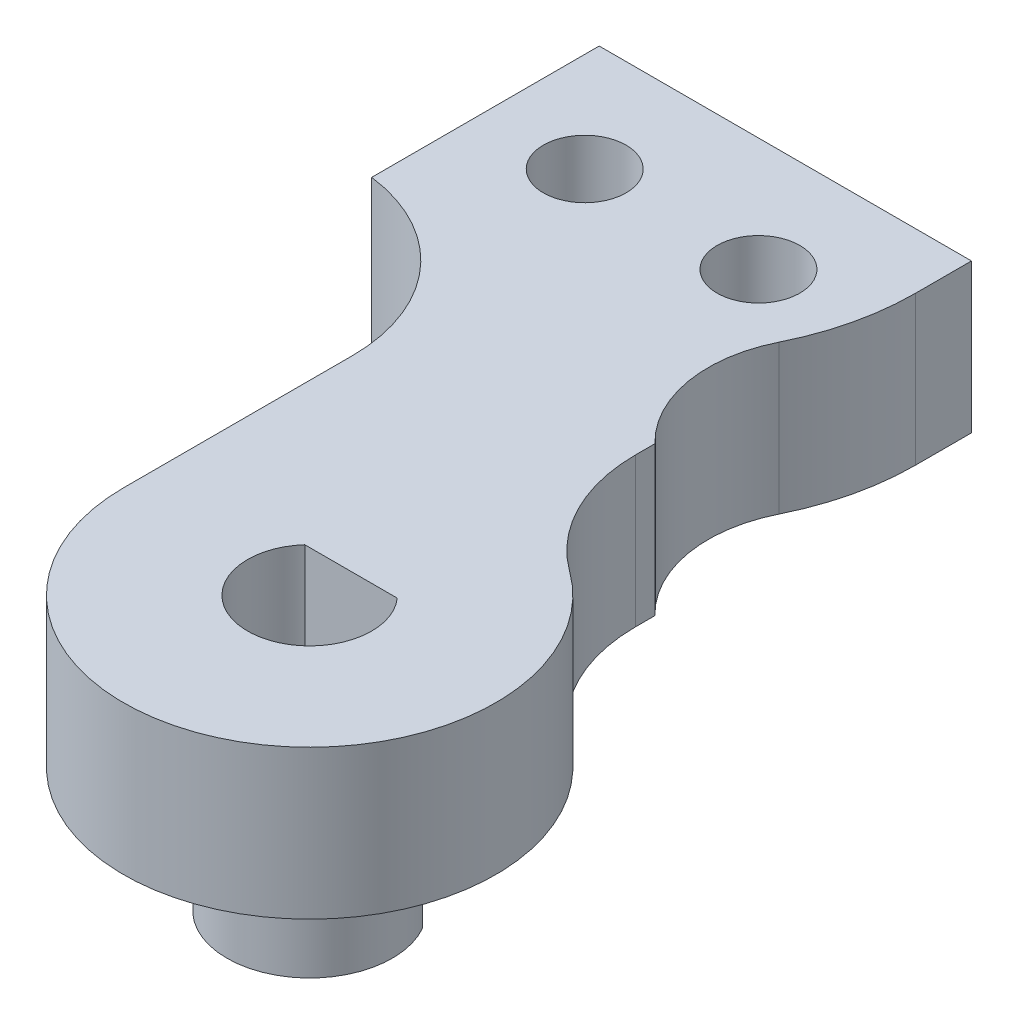
ISO-10303-21;
HEADER;
FILE_DESCRIPTION(('STEP AP214'),'2;1');
FILE_NAME('part.step','',(''),(''),'','','');
FILE_SCHEMA(('AUTOMOTIVE_DESIGN { 1 0 10303 214 1 1 1 1 }'));
ENDSEC;
DATA;
#1=APPLICATION_CONTEXT('core data for automotive mechanical design processes');
#2=APPLICATION_PROTOCOL_DEFINITION('international standard','automotive_design',2000,#1);
#3=PRODUCT_CONTEXT('',#1,'mechanical');
#4=PRODUCT('Part','Part','',(#3));
#5=PRODUCT_RELATED_PRODUCT_CATEGORY('part','',(#4));
#6=PRODUCT_DEFINITION_FORMATION('','',#4);
#7=PRODUCT_DEFINITION_CONTEXT('part definition',#1,'design');
#8=PRODUCT_DEFINITION('design','',#6,#7);
#9=PRODUCT_DEFINITION_SHAPE('','',#8);
#10=(LENGTH_UNIT() NAMED_UNIT(*) SI_UNIT(.MILLI.,.METRE.));
#11=(NAMED_UNIT(*) PLANE_ANGLE_UNIT() SI_UNIT($,.RADIAN.));
#12=(NAMED_UNIT(*) SI_UNIT($,.STERADIAN.) SOLID_ANGLE_UNIT());
#13=UNCERTAINTY_MEASURE_WITH_UNIT(LENGTH_MEASURE(1.E-05),#10,'distance_accuracy_value','');
#14=(GEOMETRIC_REPRESENTATION_CONTEXT(3) GLOBAL_UNCERTAINTY_ASSIGNED_CONTEXT((#13)) GLOBAL_UNIT_ASSIGNED_CONTEXT((#10,
#11,#12)) REPRESENTATION_CONTEXT('',''));
#15=CARTESIAN_POINT('',(0.,0.,0.));
#16=DIRECTION('',(0.,0.,1.));
#17=DIRECTION('',(1.,0.,0.));
#18=AXIS2_PLACEMENT_3D('',#15,#16,#17);
#19=CARTESIAN_POINT('',(4.5,-11.2,3.));
#20=DIRECTION('',(-1.,0.,0.));
#21=DIRECTION('',(0.,0.,1.));
#22=AXIS2_PLACEMENT_3D('',#19,#20,#21);
#23=PLANE('',#22);
#24=DIRECTION('',(0.,1.,0.));
#25=VECTOR('',#24,1.);
#26=CARTESIAN_POINT('',(4.5,-11.2,8.12613645756624));
#27=LINE('',#26,#25);
#28=CARTESIAN_POINT('',(4.5,-8.2,8.12613645756624));
#29=VERTEX_POINT('',#28);
#30=CARTESIAN_POINT('',(4.5,-11.8,8.12613645756624));
#31=VERTEX_POINT('',#30);
#32=EDGE_CURVE('E272',#29,#31,#27,.F.);
#33=ORIENTED_EDGE('',*,*,#32,.T.);
#34=DIRECTION('',(0.,0.,1.));
#35=VECTOR('',#34,1.);
#36=CARTESIAN_POINT('',(4.5,-11.8,7.65292663552222));
#37=LINE('',#36,#35);
#38=CARTESIAN_POINT('',(4.5,-11.8,7.65292663552222));
#39=VERTEX_POINT('',#38);
#40=EDGE_CURVE('E209',#39,#31,#37,.T.);
#41=ORIENTED_EDGE('',*,*,#40,.F.);
#42=DIRECTION('',(0.,1.,0.));
#43=VECTOR('',#42,1.);
#44=CARTESIAN_POINT('',(4.5,-11.201,7.65292663552222));
#45=LINE('',#44,#43);
#46=CARTESIAN_POINT('',(4.5,-8.2,7.65292663552222));
#47=VERTEX_POINT('',#46);
#48=EDGE_CURVE('E229',#39,#47,#45,.T.);
#49=ORIENTED_EDGE('',*,*,#48,.T.);
#50=DIRECTION('',(0.,0.,1.));
#51=VECTOR('',#50,1.);
#52=CARTESIAN_POINT('',(4.5,-8.2,0.));
#53=LINE('',#52,#51);
#54=EDGE_CURVE('E256',#47,#29,#53,.T.);
#55=ORIENTED_EDGE('',*,*,#54,.T.);
#56=EDGE_LOOP('',(#33,#41,#49,#55));
#57=FACE_BOUND('',#56,.T.);
#58=ADVANCED_FACE('F42',(#57),#23,.F.);
#59=CARTESIAN_POINT('',(0.,0.,0.));
#60=DIRECTION('',(0.,0.,-1.));
#61=DIRECTION('',(-1.,0.,0.));
#62=AXIS2_PLACEMENT_3D('',#59,#60,#61);
#63=PLANE('',#62);
#64=DIRECTION('',(0.,-1.,0.));
#65=VECTOR('',#64,1.);
#66=CARTESIAN_POINT('',(-4.5,-11.2,0.));
#67=LINE('',#66,#65);
#68=CARTESIAN_POINT('',(-4.5,-8.2,0.));
#69=VERTEX_POINT('',#68);
#70=CARTESIAN_POINT('',(-4.5,-11.8,0.));
#71=VERTEX_POINT('',#70);
#72=EDGE_CURVE('E270',#69,#71,#67,.T.);
#73=ORIENTED_EDGE('',*,*,#72,.F.);
#74=DIRECTION('',(1.,0.,0.));
#75=VECTOR('',#74,1.);
#76=CARTESIAN_POINT('',(0.,-8.2,0.));
#77=LINE('',#76,#75);
#78=CARTESIAN_POINT('',(4.5,-8.2,0.));
#79=VERTEX_POINT('',#78);
#80=EDGE_CURVE('E240',#69,#79,#77,.T.);
#81=ORIENTED_EDGE('',*,*,#80,.T.);
#82=DIRECTION('',(0.,1.,0.));
#83=VECTOR('',#82,1.);
#84=CARTESIAN_POINT('',(4.5,-11.2,0.));
#85=LINE('',#84,#83);
#86=CARTESIAN_POINT('',(4.5,-11.8,0.));
#87=VERTEX_POINT('',#86);
#88=EDGE_CURVE('E267',#87,#79,#85,.T.);
#89=ORIENTED_EDGE('',*,*,#88,.F.);
#90=DIRECTION('',(1.,0.,0.));
#91=VECTOR('',#90,1.);
#92=CARTESIAN_POINT('',(-4.5,-11.8,0.));
#93=LINE('',#92,#91);
#94=EDGE_CURVE('E197',#71,#87,#93,.T.);
#95=ORIENTED_EDGE('',*,*,#94,.F.);
#96=EDGE_LOOP('',(#73,#81,#89,#95));
#97=FACE_BOUND('',#96,.T.);
#98=ADVANCED_FACE('F345',(#97),#63,.T.);
#99=CARTESIAN_POINT('',(4.5,-8.2,1.35674083512681));
#100=VERTEX_POINT('',#99);
#101=EDGE_CURVE('E257',#79,#100,#53,.T.);
#102=ORIENTED_EDGE('',*,*,#101,.T.);
#103=DIRECTION('',(0.,1.,0.));
#104=VECTOR('',#103,1.);
#105=CARTESIAN_POINT('',(4.5,-11.2,1.35674083512681));
#106=LINE('',#105,#104);
#107=CARTESIAN_POINT('',(4.5,-11.8,1.35674083512681));
#108=VERTEX_POINT('',#107);
#109=EDGE_CURVE('E288',#100,#108,#106,.F.);
#110=ORIENTED_EDGE('',*,*,#109,.T.);
#111=DIRECTION('',(0.,0.,1.));
#112=VECTOR('',#111,1.);
#113=CARTESIAN_POINT('',(4.5,-11.8,0.));
#114=LINE('',#113,#112);
#115=EDGE_CURVE('E200',#87,#108,#114,.T.);
#116=ORIENTED_EDGE('',*,*,#115,.F.);
#117=ORIENTED_EDGE('',*,*,#88,.T.);
#118=EDGE_LOOP('',(#102,#110,#116,#117));
#119=FACE_BOUND('',#118,.T.);
#120=ADVANCED_FACE('F348',(#119),#23,.F.);
#121=CARTESIAN_POINT('',(-4.5,-11.2,3.));
#122=DIRECTION('',(1.,0.,0.));
#123=DIRECTION('',(0.,0.,-1.));
#124=AXIS2_PLACEMENT_3D('',#121,#122,#123);
#125=PLANE('',#124);
#126=DIRECTION('',(0.,0.,1.));
#127=VECTOR('',#126,1.);
#128=CARTESIAN_POINT('',(-4.5,-8.2,3.));
#129=LINE('',#128,#127);
#130=CARTESIAN_POINT('',(-4.5,-8.2,5.5));
#131=VERTEX_POINT('',#130);
#132=EDGE_CURVE('E238',#69,#131,#129,.T.);
#133=ORIENTED_EDGE('',*,*,#132,.F.);
#134=ORIENTED_EDGE('',*,*,#72,.T.);
#135=DIRECTION('',(0.,0.,-1.));
#136=VECTOR('',#135,1.);
#137=CARTESIAN_POINT('',(-4.5,-11.8,5.5));
#138=LINE('',#137,#136);
#139=CARTESIAN_POINT('',(-4.5,-11.8,5.5));
#140=VERTEX_POINT('',#139);
#141=EDGE_CURVE('E224',#140,#71,#138,.T.);
#142=ORIENTED_EDGE('',*,*,#141,.F.);
#143=DIRECTION('',(0.,-1.,0.));
#144=VECTOR('',#143,1.);
#145=CARTESIAN_POINT('',(-4.5,21.7475115548645,5.5));
#146=LINE('',#145,#144);
#147=EDGE_CURVE('E243',#131,#140,#146,.T.);
#148=ORIENTED_EDGE('',*,*,#147,.F.);
#149=EDGE_LOOP('',(#133,#134,#142,#148));
#150=FACE_BOUND('',#149,.T.);
#151=ADVANCED_FACE('F337',(#150),#125,.F.);
#152=CARTESIAN_POINT('',(3.5,-8.2,15.));
#153=DIRECTION('',(0.,-1.,0.));
#154=DIRECTION('',(0.,0.,-1.));
#155=AXIS2_PLACEMENT_3D('',#152,#153,#154);
#156=CYLINDRICAL_SURFACE('',#155,1.5);
#157=CARTESIAN_POINT('',(3.5,-8.2,15.));
#158=DIRECTION('',(0.,1.,0.));
#159=DIRECTION('',(0.,0.,1.));
#160=AXIS2_PLACEMENT_3D('',#157,#158,#159);
#161=CIRCLE('',#160,1.5);
#162=CARTESIAN_POINT('',(2.3819660112501,-8.2,14.));
#163=VERTEX_POINT('',#162);
#164=CARTESIAN_POINT('',(4.61803398874989,-8.2,14.));
#165=VERTEX_POINT('',#164);
#166=EDGE_CURVE('E263',#163,#165,#161,.T.);
#167=ORIENTED_EDGE('',*,*,#166,.T.);
#168=DIRECTION('',(0.,-1.,0.));
#169=VECTOR('',#168,1.);
#170=CARTESIAN_POINT('',(4.61803398874989,-5.90871215252208,14.));
#171=LINE('',#170,#169);
#172=CARTESIAN_POINT('',(4.61803398874989,-11.8,14.));
#173=VERTEX_POINT('',#172);
#174=EDGE_CURVE('E250',#165,#173,#171,.T.);
#175=ORIENTED_EDGE('',*,*,#174,.T.);
#176=DIRECTION('',(0.,1.,0.));
#177=VECTOR('',#176,1.);
#178=CARTESIAN_POINT('',(4.61803398874989,-14.8,14.));
#179=LINE('',#178,#177);
#180=CARTESIAN_POINT('',(4.61803398874989,-14.8,14.));
#181=VERTEX_POINT('',#180);
#182=EDGE_CURVE('E400',#181,#173,#179,.T.);
#183=ORIENTED_EDGE('',*,*,#182,.F.);
#184=CARTESIAN_POINT('',(3.5,-14.8,15.));
#185=DIRECTION('',(0.,-1.,0.));
#186=DIRECTION('',(0.,0.,-1.));
#187=AXIS2_PLACEMENT_3D('',#184,#185,#186);
#188=CIRCLE('',#187,1.5);
#189=CARTESIAN_POINT('',(2.3819660112501,-14.8,14.));
#190=VERTEX_POINT('',#189);
#191=EDGE_CURVE('E178',#190,#181,#188,.F.);
#192=ORIENTED_EDGE('',*,*,#191,.F.);
#193=DIRECTION('',(0.,1.,0.));
#194=VECTOR('',#193,1.);
#195=CARTESIAN_POINT('',(2.3819660112501,-14.8,14.));
#196=LINE('',#195,#194);
#197=CARTESIAN_POINT('',(2.3819660112501,-11.8,14.));
#198=VERTEX_POINT('',#197);
#199=EDGE_CURVE('E188',#190,#198,#196,.T.);
#200=ORIENTED_EDGE('',*,*,#199,.T.);
#201=DIRECTION('',(0.,-1.,0.));
#202=VECTOR('',#201,1.);
#203=CARTESIAN_POINT('',(2.3819660112501,-5.90871215252208,14.));
#204=LINE('',#203,#202);
#205=EDGE_CURVE('E245',#163,#198,#204,.T.);
#206=ORIENTED_EDGE('',*,*,#205,.F.);
#207=EDGE_LOOP('',(#167,#175,#183,#192,#200,#206));
#208=FACE_BOUND('',#207,.T.);
#209=ADVANCED_FACE('F333',(#208),#156,.F.);
#210=CARTESIAN_POINT('',(-1.,-8.2,0.));
#211=DIRECTION('',(-1.,0.,0.));
#212=DIRECTION('',(0.,0.,1.));
#213=AXIS2_PLACEMENT_3D('',#210,#211,#212);
#214=PLANE('',#213);
#215=DIRECTION('',(0.,0.,-1.));
#216=VECTOR('',#215,1.);
#217=CARTESIAN_POINT('',(-1.,-8.2,0.));
#218=LINE('',#217,#216);
#219=CARTESIAN_POINT('',(-1.,-8.2,15.));
#220=VERTEX_POINT('',#219);
#221=CARTESIAN_POINT('',(-1.,-8.2,9.46862696659688));
#222=VERTEX_POINT('',#221);
#223=EDGE_CURVE('E249',#220,#222,#218,.T.);
#224=ORIENTED_EDGE('',*,*,#223,.T.);
#225=DIRECTION('',(0.,-1.,0.));
#226=VECTOR('',#225,1.);
#227=CARTESIAN_POINT('',(-1.,-11.2,9.46862696659688));
#228=LINE('',#227,#226);
#229=CARTESIAN_POINT('',(-1.,-11.8,9.46862696659688));
#230=VERTEX_POINT('',#229);
#231=EDGE_CURVE('E279',#222,#230,#228,.T.);
#232=ORIENTED_EDGE('',*,*,#231,.T.);
#233=DIRECTION('',(0.,0.,-1.));
#234=VECTOR('',#233,1.);
#235=CARTESIAN_POINT('',(-1.,-11.8,15.));
#236=LINE('',#235,#234);
#237=CARTESIAN_POINT('',(-1.,-11.8,15.));
#238=VERTEX_POINT('',#237);
#239=EDGE_CURVE('E218',#238,#230,#236,.T.);
#240=ORIENTED_EDGE('',*,*,#239,.F.);
#241=DIRECTION('',(0.,-1.,0.));
#242=VECTOR('',#241,1.);
#243=CARTESIAN_POINT('',(-1.,-8.2,15.));
#244=LINE('',#243,#242);
#245=EDGE_CURVE('E265',#220,#238,#244,.T.);
#246=ORIENTED_EDGE('',*,*,#245,.F.);
#247=EDGE_LOOP('',(#224,#232,#240,#246));
#248=FACE_BOUND('',#247,.T.);
#249=ADVANCED_FACE('F336',(#248),#214,.T.);
#250=CARTESIAN_POINT('',(3.5,-8.2,15.));
#251=DIRECTION('',(0.,-1.,0.));
#252=DIRECTION('',(0.,0.,-1.));
#253=AXIS2_PLACEMENT_3D('',#250,#251,#252);
#254=CYLINDRICAL_SURFACE('',#253,4.5);
#255=ORIENTED_EDGE('',*,*,#245,.T.);
#256=CARTESIAN_POINT('',(3.5,-11.8,15.));
#257=DIRECTION('',(0.,-1.,0.));
#258=DIRECTION('',(0.,0.,-1.));
#259=AXIS2_PLACEMENT_3D('',#256,#257,#258);
#260=CIRCLE('',#259,4.5);
#261=CARTESIAN_POINT('',(6.14705882352941,-11.8,11.3608957716527));
#262=VERTEX_POINT('',#261);
#263=EDGE_CURVE('E215',#262,#238,#260,.T.);
#264=ORIENTED_EDGE('',*,*,#263,.F.);
#265=DIRECTION('',(0.,-1.,0.));
#266=VECTOR('',#265,1.);
#267=CARTESIAN_POINT('',(6.14705882352941,-8.2,11.3608957716527));
#268=LINE('',#267,#266);
#269=CARTESIAN_POINT('',(6.14705882352941,-8.2,11.3608957716527));
#270=VERTEX_POINT('',#269);
#271=EDGE_CURVE('E274',#262,#270,#268,.F.);
#272=ORIENTED_EDGE('',*,*,#271,.T.);
#273=CARTESIAN_POINT('',(3.5,-8.2,15.));
#274=DIRECTION('',(0.,1.,0.));
#275=DIRECTION('',(0.,0.,1.));
#276=AXIS2_PLACEMENT_3D('',#273,#274,#275);
#277=CIRCLE('',#276,4.5);
#278=EDGE_CURVE('E260',#220,#270,#277,.T.);
#279=ORIENTED_EDGE('',*,*,#278,.F.);
#280=EDGE_LOOP('',(#255,#264,#272,#279));
#281=FACE_BOUND('',#280,.T.);
#282=ADVANCED_FACE('F331',(#281),#254,.T.);
#283=CARTESIAN_POINT('',(0.,-8.2,0.));
#284=DIRECTION('',(0.,-1.,0.));
#285=DIRECTION('',(0.,0.,1.));
#286=AXIS2_PLACEMENT_3D('',#283,#284,#285);
#287=PLANE('',#286);
#288=CARTESIAN_POINT('',(-2.1,-8.19999999999999,2.75));
#289=DIRECTION('',(0.,-1.,0.));
#290=DIRECTION('',(0.,0.,-1.));
#291=AXIS2_PLACEMENT_3D('',#288,#289,#290);
#292=CIRCLE('',#291,0.999999999999999);
#293=CARTESIAN_POINT('',(-2.1,-8.19999999999999,1.75));
#294=VERTEX_POINT('',#293);
#295=EDGE_CURVE('E232',#294,#294,#292,.T.);
#296=ORIENTED_EDGE('',*,*,#295,.T.);
#297=EDGE_LOOP('',(#296));
#298=FACE_BOUND('',#297,.T.);
#299=CARTESIAN_POINT('',(2.1,-8.19999999999999,2.75));
#300=DIRECTION('',(0.,-1.,0.));
#301=DIRECTION('',(0.,0.,-1.));
#302=AXIS2_PLACEMENT_3D('',#299,#300,#301);
#303=CIRCLE('',#302,0.999999999999999);
#304=CARTESIAN_POINT('',(2.1,-8.19999999999999,1.75));
#305=VERTEX_POINT('',#304);
#306=EDGE_CURVE('E235',#305,#305,#303,.T.);
#307=ORIENTED_EDGE('',*,*,#306,.T.);
#308=EDGE_LOOP('',(#307));
#309=FACE_BOUND('',#308,.T.);
#310=CARTESIAN_POINT('',(6.66752866875015,-8.2,5.41098434858206));
#311=DIRECTION('',(0.,1.,0.));
#312=DIRECTION('',(0.,0.,1.));
#313=AXIS2_PLACEMENT_3D('',#310,#311,#312);
#314=CIRCLE('',#313,3.11841077278544);
#315=CARTESIAN_POINT('',(3.87431063741506,-8.2,4.02447117617841));
#316=VERTEX_POINT('',#315);
#317=EDGE_CURVE('E227',#316,#47,#314,.T.);
#318=ORIENTED_EDGE('',*,*,#317,.F.);
#319=CARTESIAN_POINT('',(-1.5,-8.2,1.35674083512681));
#320=DIRECTION('',(0.,-1.,0.));
#321=DIRECTION('',(0.,0.,-1.));
#322=AXIS2_PLACEMENT_3D('',#319,#320,#321);
#323=CIRCLE('',#322,6.);
#324=EDGE_CURVE('E286',#316,#100,#323,.F.);
#325=ORIENTED_EDGE('',*,*,#324,.T.);
#326=ORIENTED_EDGE('',*,*,#101,.F.);
#327=ORIENTED_EDGE('',*,*,#80,.F.);
#328=ORIENTED_EDGE('',*,*,#132,.T.);
#329=CARTESIAN_POINT('',(-5.,-8.2,9.46862696659688));
#330=DIRECTION('',(0.,-1.,0.));
#331=DIRECTION('',(0.,0.,-1.));
#332=AXIS2_PLACEMENT_3D('',#329,#330,#331);
#333=CIRCLE('',#332,4.);
#334=EDGE_CURVE('E281',#131,#222,#333,.T.);
#335=ORIENTED_EDGE('',*,*,#334,.T.);
#336=ORIENTED_EDGE('',*,*,#223,.F.);
#337=ORIENTED_EDGE('',*,*,#278,.T.);
#338=CARTESIAN_POINT('',(8.5,-8.2,8.12613645756624));
#339=DIRECTION('',(0.,-1.,0.));
#340=DIRECTION('',(0.,0.,-1.));
#341=AXIS2_PLACEMENT_3D('',#338,#339,#340);
#342=CIRCLE('',#341,4.);
#343=EDGE_CURVE('E276',#270,#29,#342,.T.);
#344=ORIENTED_EDGE('',*,*,#343,.T.);
#345=ORIENTED_EDGE('',*,*,#54,.F.);
#346=EDGE_LOOP('',(#318,#325,#326,#327,#328,#335,#336,#337,#344,#345));
#347=FACE_BOUND('',#346,.T.);
#348=ORIENTED_EDGE('',*,*,#166,.F.);
#349=DIRECTION('',(-1.,0.,0.));
#350=VECTOR('',#349,1.);
#351=CARTESIAN_POINT('',(0.,-8.2,14.));
#352=LINE('',#351,#350);
#353=EDGE_CURVE('E246',#165,#163,#352,.T.);
#354=ORIENTED_EDGE('',*,*,#353,.F.);
#355=EDGE_LOOP('',(#348,#354));
#356=FACE_BOUND('',#355,.T.);
#357=ADVANCED_FACE('F328',(#298,#309,#347,#356),#287,.F.);
#358=CARTESIAN_POINT('',(8.5,-8.2,8.12613645756624));
#359=DIRECTION('',(0.,-1.,0.));
#360=DIRECTION('',(0.,0.,-1.));
#361=AXIS2_PLACEMENT_3D('',#358,#359,#360);
#362=CYLINDRICAL_SURFACE('',#361,4.);
#363=ORIENTED_EDGE('',*,*,#343,.F.);
#364=ORIENTED_EDGE('',*,*,#271,.F.);
#365=CARTESIAN_POINT('',(8.5,-11.8,8.12613645756624));
#366=DIRECTION('',(0.,1.,0.));
#367=DIRECTION('',(0.,0.,-1.));
#368=AXIS2_PLACEMENT_3D('',#365,#366,#367);
#369=CIRCLE('',#368,4.);
#370=EDGE_CURVE('E212',#31,#262,#369,.T.);
#371=ORIENTED_EDGE('',*,*,#370,.F.);
#372=ORIENTED_EDGE('',*,*,#32,.F.);
#373=EDGE_LOOP('',(#363,#364,#371,#372));
#374=FACE_BOUND('',#373,.T.);
#375=ADVANCED_FACE('F326',(#374),#362,.F.);
#376=CARTESIAN_POINT('',(0.,-5.90871215252208,14.));
#377=DIRECTION('',(0.,0.,-1.));
#378=DIRECTION('',(-1.,0.,0.));
#379=AXIS2_PLACEMENT_3D('',#376,#377,#378);
#380=PLANE('',#379);
#381=ORIENTED_EDGE('',*,*,#174,.F.);
#382=ORIENTED_EDGE('',*,*,#353,.T.);
#383=ORIENTED_EDGE('',*,*,#205,.T.);
#384=DIRECTION('',(1.,0.,0.));
#385=VECTOR('',#384,1.);
#386=CARTESIAN_POINT('',(2.3819660112501,-11.8,14.));
#387=LINE('',#386,#385);
#388=EDGE_CURVE('E194',#198,#173,#387,.T.);
#389=ORIENTED_EDGE('',*,*,#388,.T.);
#390=EDGE_LOOP('',(#381,#382,#383,#389));
#391=FACE_BOUND('',#390,.T.);
#392=ADVANCED_FACE('F323',(#391),#380,.F.);
#393=CARTESIAN_POINT('',(-5.,21.7475115548645,9.46862696659688));
#394=DIRECTION('',(0.,1.,0.));
#395=DIRECTION('',(0.,0.,1.));
#396=AXIS2_PLACEMENT_3D('',#393,#394,#395);
#397=CYLINDRICAL_SURFACE('',#396,4.);
#398=ORIENTED_EDGE('',*,*,#147,.T.);
#399=CARTESIAN_POINT('',(-5.,-11.8,9.46862696659688));
#400=DIRECTION('',(0.,1.,0.));
#401=DIRECTION('',(0.,0.,-1.));
#402=AXIS2_PLACEMENT_3D('',#399,#400,#401);
#403=CIRCLE('',#402,4.);
#404=EDGE_CURVE('E221',#230,#140,#403,.T.);
#405=ORIENTED_EDGE('',*,*,#404,.F.);
#406=ORIENTED_EDGE('',*,*,#231,.F.);
#407=ORIENTED_EDGE('',*,*,#334,.F.);
#408=EDGE_LOOP('',(#398,#405,#406,#407));
#409=FACE_BOUND('',#408,.T.);
#410=ADVANCED_FACE('F321',(#409),#397,.F.);
#411=CARTESIAN_POINT('',(2.1,-11.2,2.75));
#412=DIRECTION('',(0.,-1.,0.));
#413=DIRECTION('',(0.,0.,-1.));
#414=AXIS2_PLACEMENT_3D('',#411,#412,#413);
#415=CYLINDRICAL_SURFACE('',#414,0.999999999999999);
#416=ORIENTED_EDGE('',*,*,#306,.F.);
#417=EDGE_LOOP('',(#416));
#418=FACE_BOUND('',#417,.T.);
#419=CARTESIAN_POINT('',(2.1,-11.8,2.75));
#420=DIRECTION('',(0.,-1.,0.));
#421=DIRECTION('',(0.,0.,-1.));
#422=AXIS2_PLACEMENT_3D('',#419,#420,#421);
#423=CIRCLE('',#422,1.);
#424=CARTESIAN_POINT('',(2.1,-11.8,1.75));
#425=VERTEX_POINT('',#424);
#426=EDGE_CURVE('E183',#425,#425,#423,.T.);
#427=ORIENTED_EDGE('',*,*,#426,.T.);
#428=EDGE_LOOP('',(#427));
#429=FACE_BOUND('',#428,.T.);
#430=ADVANCED_FACE('F317',(#418,#429),#415,.F.);
#431=CARTESIAN_POINT('',(-2.1,-11.2,2.75));
#432=DIRECTION('',(0.,-1.,0.));
#433=DIRECTION('',(0.,0.,-1.));
#434=AXIS2_PLACEMENT_3D('',#431,#432,#433);
#435=CYLINDRICAL_SURFACE('',#434,0.999999999999999);
#436=ORIENTED_EDGE('',*,*,#295,.F.);
#437=EDGE_LOOP('',(#436));
#438=FACE_BOUND('',#437,.T.);
#439=CARTESIAN_POINT('',(-2.1,-11.8,2.75));
#440=DIRECTION('',(0.,-1.,0.));
#441=DIRECTION('',(0.,0.,-1.));
#442=AXIS2_PLACEMENT_3D('',#439,#440,#441);
#443=CIRCLE('',#442,1.);
#444=CARTESIAN_POINT('',(-2.1,-11.8,1.75));
#445=VERTEX_POINT('',#444);
#446=EDGE_CURVE('E186',#445,#445,#443,.T.);
#447=ORIENTED_EDGE('',*,*,#446,.T.);
#448=EDGE_LOOP('',(#447));
#449=FACE_BOUND('',#448,.T.);
#450=ADVANCED_FACE('F313',(#438,#449),#435,.F.);
#451=CARTESIAN_POINT('',(6.66752866875015,-11.201,5.41098434858206));
#452=DIRECTION('',(0.,1.,0.));
#453=DIRECTION('',(0.,0.,1.));
#454=AXIS2_PLACEMENT_3D('',#451,#452,#453);
#455=CYLINDRICAL_SURFACE('',#454,3.11841077278544);
#456=ORIENTED_EDGE('',*,*,#48,.F.);
#457=CARTESIAN_POINT('',(6.66752866875015,-11.8,5.41098434858206));
#458=DIRECTION('',(0.,1.,0.));
#459=DIRECTION('',(0.,0.,-1.));
#460=AXIS2_PLACEMENT_3D('',#457,#458,#459);
#461=CIRCLE('',#460,3.11841077278544);
#462=CARTESIAN_POINT('',(3.87431063741506,-11.8,4.02447117617841));
#463=VERTEX_POINT('',#462);
#464=EDGE_CURVE('E206',#463,#39,#461,.T.);
#465=ORIENTED_EDGE('',*,*,#464,.F.);
#466=DIRECTION('',(0.,1.,0.));
#467=VECTOR('',#466,1.);
#468=CARTESIAN_POINT('',(3.87431063741506,-11.201,4.02447117617841));
#469=LINE('',#468,#467);
#470=EDGE_CURVE('E283',#463,#316,#469,.T.);
#471=ORIENTED_EDGE('',*,*,#470,.T.);
#472=ORIENTED_EDGE('',*,*,#317,.T.);
#473=EDGE_LOOP('',(#456,#465,#471,#472));
#474=FACE_BOUND('',#473,.T.);
#475=ADVANCED_FACE('F310',(#474),#455,.F.);
#476=CARTESIAN_POINT('',(-1.5,-11.201,1.35674083512681));
#477=DIRECTION('',(0.,1.,0.));
#478=DIRECTION('',(0.,0.,1.));
#479=AXIS2_PLACEMENT_3D('',#476,#477,#478);
#480=CYLINDRICAL_SURFACE('',#479,6.);
#481=ORIENTED_EDGE('',*,*,#470,.F.);
#482=CARTESIAN_POINT('',(-1.5,-11.8,1.35674083512681));
#483=DIRECTION('',(0.,-1.,0.));
#484=DIRECTION('',(0.,0.,-1.));
#485=AXIS2_PLACEMENT_3D('',#482,#483,#484);
#486=CIRCLE('',#485,6.);
#487=EDGE_CURVE('E203',#108,#463,#486,.T.);
#488=ORIENTED_EDGE('',*,*,#487,.F.);
#489=ORIENTED_EDGE('',*,*,#109,.F.);
#490=ORIENTED_EDGE('',*,*,#324,.F.);
#491=EDGE_LOOP('',(#481,#488,#489,#490));
#492=FACE_BOUND('',#491,.T.);
#493=ADVANCED_FACE('F309',(#492),#480,.T.);
#494=CARTESIAN_POINT('',(-1.5,-11.8,1.35674083512681));
#495=DIRECTION('',(0.,-1.,0.));
#496=DIRECTION('',(0.,0.,-1.));
#497=AXIS2_PLACEMENT_3D('',#494,#495,#496);
#498=PLANE('',#497);
#499=DIRECTION('',(1.,0.,0.));
#500=VECTOR('',#499,1.);
#501=CARTESIAN_POINT('',(0.,-11.8,14.));
#502=LINE('',#501,#500);
#503=CARTESIAN_POINT('',(1.54040820577346,-11.8,14.));
#504=VERTEX_POINT('',#503);
#505=EDGE_CURVE('E63',#504,#198,#502,.T.);
#506=ORIENTED_EDGE('',*,*,#505,.F.);
#507=CARTESIAN_POINT('',(3.5,-11.8,15.));
#508=DIRECTION('',(0.,-1.,0.));
#509=DIRECTION('',(0.,0.,-1.));
#510=AXIS2_PLACEMENT_3D('',#507,#508,#509);
#511=CIRCLE('',#510,2.2);
#512=CARTESIAN_POINT('',(5.45959179422654,-11.8,14.));
#513=VERTEX_POINT('',#512);
#514=EDGE_CURVE('E292',#504,#513,#511,.F.);
#515=ORIENTED_EDGE('',*,*,#514,.T.);
#516=EDGE_CURVE('E70',#173,#513,#502,.T.);
#517=ORIENTED_EDGE('',*,*,#516,.F.);
#518=ORIENTED_EDGE('',*,*,#388,.F.);
#519=EDGE_LOOP('',(#506,#515,#517,#518));
#520=FACE_BOUND('',#519,.T.);
#521=ORIENTED_EDGE('',*,*,#446,.F.);
#522=EDGE_LOOP('',(#521));
#523=FACE_BOUND('',#522,.T.);
#524=ORIENTED_EDGE('',*,*,#94,.T.);
#525=ORIENTED_EDGE('',*,*,#115,.T.);
#526=ORIENTED_EDGE('',*,*,#487,.T.);
#527=ORIENTED_EDGE('',*,*,#464,.T.);
#528=ORIENTED_EDGE('',*,*,#40,.T.);
#529=ORIENTED_EDGE('',*,*,#370,.T.);
#530=ORIENTED_EDGE('',*,*,#263,.T.);
#531=ORIENTED_EDGE('',*,*,#239,.T.);
#532=ORIENTED_EDGE('',*,*,#404,.T.);
#533=ORIENTED_EDGE('',*,*,#141,.T.);
#534=EDGE_LOOP('',(#524,#525,#526,#527,#528,#529,#530,#531,#532,#533));
#535=FACE_BOUND('',#534,.T.);
#536=ORIENTED_EDGE('',*,*,#426,.F.);
#537=EDGE_LOOP('',(#536));
#538=FACE_BOUND('',#537,.T.);
#539=ADVANCED_FACE('F306',(#520,#523,#535,#538),#498,.T.);
#540=CARTESIAN_POINT('',(0.,-14.8,14.));
#541=DIRECTION('',(0.,0.,1.));
#542=DIRECTION('',(1.,0.,0.));
#543=AXIS2_PLACEMENT_3D('',#540,#541,#542);
#544=PLANE('',#543);
#545=ORIENTED_EDGE('',*,*,#516,.T.);
#546=CARTESIAN_POINT('',(5.45959179422654,-11.8,14.));
#547=CARTESIAN_POINT('',(5.44552336467392,-11.7999977819809,14.));
#548=CARTESIAN_POINT('',(5.43145293086457,-11.801177888807,14.));
#549=CARTESIAN_POINT('',(5.40366439974049,-11.8058612140611,14.));
#550=CARTESIAN_POINT('',(5.38994738895796,-11.8093708724433,14.));
#551=CARTESIAN_POINT('',(5.36328902775628,-11.8186766785327,14.));
#552=CARTESIAN_POINT('',(5.35034860005172,-11.824475486515,14.));
#553=CARTESIAN_POINT('',(5.3257088706806,-11.8382819731366,14.));
#554=CARTESIAN_POINT('',(5.31400844160661,-11.846287621044,14.));
#555=CARTESIAN_POINT('',(5.29294184397623,-11.8638743718059,14.));
#556=CARTESIAN_POINT('',(5.28348171469882,-11.873342301051,14.));
#557=CARTESIAN_POINT('',(5.26657259235869,-11.8939424276204,14.));
#558=CARTESIAN_POINT('',(5.25912234472378,-11.9050735799827,14.));
#559=CARTESIAN_POINT('',(5.24752009704612,-11.9271191305711,14.));
#560=CARTESIAN_POINT('',(5.24306580442124,-11.9378747078255,14.));
#561=CARTESIAN_POINT('',(5.23632524708262,-11.9600314944875,14.));
#562=CARTESIAN_POINT('',(5.2340326138767,-11.9714307018478,14.));
#563=CARTESIAN_POINT('',(5.23261298080871,-11.985761177888,14.));
#564=CARTESIAN_POINT('',(5.23240215493883,-11.9886068001717,14.));
#565=CARTESIAN_POINT('',(5.23212131057844,-11.9943011653808,14.));
#566=CARTESIAN_POINT('',(5.23205110366184,-11.9971498990057,14.));
#567=CARTESIAN_POINT('',(5.23205080756888,-12.,14.));
#568=B_SPLINE_CURVE_WITH_KNOTS('',3,(#546,#547,#548,#549,#550,#551,#552,#553,#554,#555,#556,
#557,#558,#559,#560,#561,#562,#563,#564,#565,#566,#567),.UNSPECIFIED.,.F.,.F.,(4,2,2,2,2,2,2,2,
2,2,4),(0.,0.0421607600731387,0.0844385600655756,0.126765637418823,0.169053894711532,
0.208976705752316,0.248874538928987,0.283602335273677,0.318227496958981,0.326785680295717,
0.335332388175143),.UNSPECIFIED.);
#569=CARTESIAN_POINT('',(5.23205080756887,-12.,14.));
#570=VERTEX_POINT('',#569);
#571=EDGE_CURVE('E12',#513,#570,#568,.T.);
#572=ORIENTED_EDGE('',*,*,#571,.T.);
#573=DIRECTION('',(0.,1.,0.));
#574=VECTOR('',#573,1.);
#575=CARTESIAN_POINT('',(5.23205080756887,-14.8,14.));
#576=LINE('',#575,#574);
#577=CARTESIAN_POINT('',(5.23205080756887,-14.8,14.));
#578=VERTEX_POINT('',#577);
#579=EDGE_CURVE('E166',#578,#570,#576,.T.);
#580=ORIENTED_EDGE('',*,*,#579,.F.);
#581=DIRECTION('',(1.,0.,0.));
#582=VECTOR('',#581,1.);
#583=CARTESIAN_POINT('',(0.,-14.8,14.));
#584=LINE('',#583,#582);
#585=EDGE_CURVE('E173',#181,#578,#584,.T.);
#586=ORIENTED_EDGE('',*,*,#585,.F.);
#587=ORIENTED_EDGE('',*,*,#182,.T.);
#588=EDGE_LOOP('',(#545,#572,#580,#586,#587));
#589=FACE_BOUND('',#588,.T.);
#590=ADVANCED_FACE('F181',(#589),#544,.F.);
#591=CARTESIAN_POINT('',(3.5,-14.8,15.));
#592=DIRECTION('',(0.,1.,0.));
#593=DIRECTION('',(0.,0.,1.));
#594=AXIS2_PLACEMENT_3D('',#591,#592,#593);
#595=CYLINDRICAL_SURFACE('',#594,2.);
#596=ORIENTED_EDGE('',*,*,#579,.T.);
#597=CARTESIAN_POINT('',(3.5,-12.,15.));
#598=DIRECTION('',(0.,-1.,0.));
#599=DIRECTION('',(0.,0.,-1.));
#600=AXIS2_PLACEMENT_3D('',#597,#598,#599);
#601=CIRCLE('',#600,2.);
#602=CARTESIAN_POINT('',(1.76794919243112,-12.,14.));
#603=VERTEX_POINT('',#602);
#604=EDGE_CURVE('E290',#570,#603,#601,.T.);
#605=ORIENTED_EDGE('',*,*,#604,.T.);
#606=DIRECTION('',(0.,1.,0.));
#607=VECTOR('',#606,1.);
#608=CARTESIAN_POINT('',(1.76794919243112,-14.8,14.));
#609=LINE('',#608,#607);
#610=CARTESIAN_POINT('',(1.76794919243112,-14.8,14.));
#611=VERTEX_POINT('',#610);
#612=EDGE_CURVE('E169',#611,#603,#609,.T.);
#613=ORIENTED_EDGE('',*,*,#612,.F.);
#614=CARTESIAN_POINT('',(3.5,-14.8,15.));
#615=DIRECTION('',(0.,-1.,0.));
#616=DIRECTION('',(0.,0.,-1.));
#617=AXIS2_PLACEMENT_3D('',#614,#615,#616);
#618=CIRCLE('',#617,2.);
#619=EDGE_CURVE('E161',#578,#611,#618,.T.);
#620=ORIENTED_EDGE('',*,*,#619,.F.);
#621=EDGE_LOOP('',(#596,#605,#613,#620));
#622=FACE_BOUND('',#621,.T.);
#623=ADVANCED_FACE('F163',(#622),#595,.T.);
#624=ORIENTED_EDGE('',*,*,#505,.T.);
#625=ORIENTED_EDGE('',*,*,#199,.F.);
#626=EDGE_CURVE('E172',#611,#190,#584,.T.);
#627=ORIENTED_EDGE('',*,*,#626,.F.);
#628=ORIENTED_EDGE('',*,*,#612,.T.);
#629=CARTESIAN_POINT('',(1.76794919243112,-12.,14.));
#630=CARTESIAN_POINT('',(1.76796508861631,-11.9897881674349,14.));
#631=CARTESIAN_POINT('',(1.76704719797168,-11.9795887928741,14.));
#632=CARTESIAN_POINT('',(1.7634736468097,-11.9595448802272,14.));
#633=CARTESIAN_POINT('',(1.76082588027712,-11.9496989435735,14.));
#634=CARTESIAN_POINT('',(1.75392369629615,-11.9306035618545,14.));
#635=CARTESIAN_POINT('',(1.74967086597597,-11.9213535380787,14.));
#636=CARTESIAN_POINT('',(1.73975216330169,-11.9036402373149,14.));
#637=CARTESIAN_POINT('',(1.73408498954899,-11.895177694823,14.));
#638=CARTESIAN_POINT('',(1.72120337427276,-11.8787541205014,14.));
#639=CARTESIAN_POINT('',(1.71392055465488,-11.8708469281632,14.));
#640=CARTESIAN_POINT('',(1.69826747755258,-11.8561998760716,14.));
#641=CARTESIAN_POINT('',(1.68989693151546,-11.8494603271821,14.));
#642=CARTESIAN_POINT('',(1.6711767518845,-11.8364416788755,14.));
#643=CARTESIAN_POINT('',(1.66071078925397,-11.8303298552075,14.));
#644=CARTESIAN_POINT('',(1.63897745171873,-11.8197412193949,14.));
#645=CARTESIAN_POINT('',(1.62770941044202,-11.81526578617,14.));
#646=CARTESIAN_POINT('',(1.6039358449951,-11.8077738883039,14.));
#647=CARTESIAN_POINT('',(1.59139681096453,-11.8048637596136,14.));
#648=CARTESIAN_POINT('',(1.56604027085046,-11.8009772326897,14.));
#649=CARTESIAN_POINT('',(1.5532231780106,-11.7999981402689,14.));
#650=CARTESIAN_POINT('',(1.54040820577345,-11.8,14.));
#651=B_SPLINE_CURVE_WITH_KNOTS('',3,(#629,#630,#631,#632,#633,#634,#635,#636,#637,#638,#639,
#640,#641,#642,#643,#644,#645,#646,#647,#648,#649,#650),.UNSPECIFIED.,.F.,.F.,(4,2,2,2,2,2,2,2,
2,2,4),(0.,0.0305747379146882,0.0610109188369072,0.0914170822023434,0.121851327419294,
0.153973382415439,0.186103976231719,0.222316582341816,0.258559633397491,0.297025897684536,
0.335438455658009),.UNSPECIFIED.);
#652=EDGE_CURVE('E56',#603,#504,#651,.T.);
#653=ORIENTED_EDGE('',*,*,#652,.T.);
#654=EDGE_LOOP('',(#624,#625,#627,#628,#653));
#655=FACE_BOUND('',#654,.T.);
#656=ADVANCED_FACE('F297',(#655),#544,.F.);
#657=CARTESIAN_POINT('',(0.,-14.8,0.));
#658=DIRECTION('',(0.,-1.,0.));
#659=DIRECTION('',(0.,0.,-1.));
#660=AXIS2_PLACEMENT_3D('',#657,#658,#659);
#661=PLANE('',#660);
#662=ORIENTED_EDGE('',*,*,#585,.T.);
#663=ORIENTED_EDGE('',*,*,#619,.T.);
#664=ORIENTED_EDGE('',*,*,#626,.T.);
#665=ORIENTED_EDGE('',*,*,#191,.T.);
#666=EDGE_LOOP('',(#662,#663,#664,#665));
#667=FACE_BOUND('',#666,.T.);
#668=ADVANCED_FACE('F176',(#667),#661,.T.);
#669=CARTESIAN_POINT('',(3.5,-12.,15.));
#670=DIRECTION('',(0.,-1.,0.));
#671=DIRECTION('',(0.,0.,-1.));
#672=AXIS2_PLACEMENT_3D('',#669,#670,#671);
#673=TOROIDAL_SURFACE('',#672,2.2,0.2);
#674=ORIENTED_EDGE('',*,*,#571,.F.);
#675=ORIENTED_EDGE('',*,*,#514,.F.);
#676=ORIENTED_EDGE('',*,*,#652,.F.);
#677=ORIENTED_EDGE('',*,*,#604,.F.);
#678=EDGE_LOOP('',(#674,#675,#676,#677));
#679=FACE_BOUND('',#678,.T.);
#680=ADVANCED_FACE('F44',(#679),#673,.F.);
#681=CLOSED_SHELL('',(#58,#98,#120,#151,#209,#249,#282,#357,#375,#392,#410,#430,#450,#475,#493,
#539,#590,#623,#656,#668,#680));
#682=MANIFOLD_SOLID_BREP('B2',#681);
#683=ADVANCED_BREP_SHAPE_REPRESENTATION('',(#18,#682),#14);
#684=SHAPE_DEFINITION_REPRESENTATION(#9,#683);
ENDSEC;
END-ISO-10303-21;
